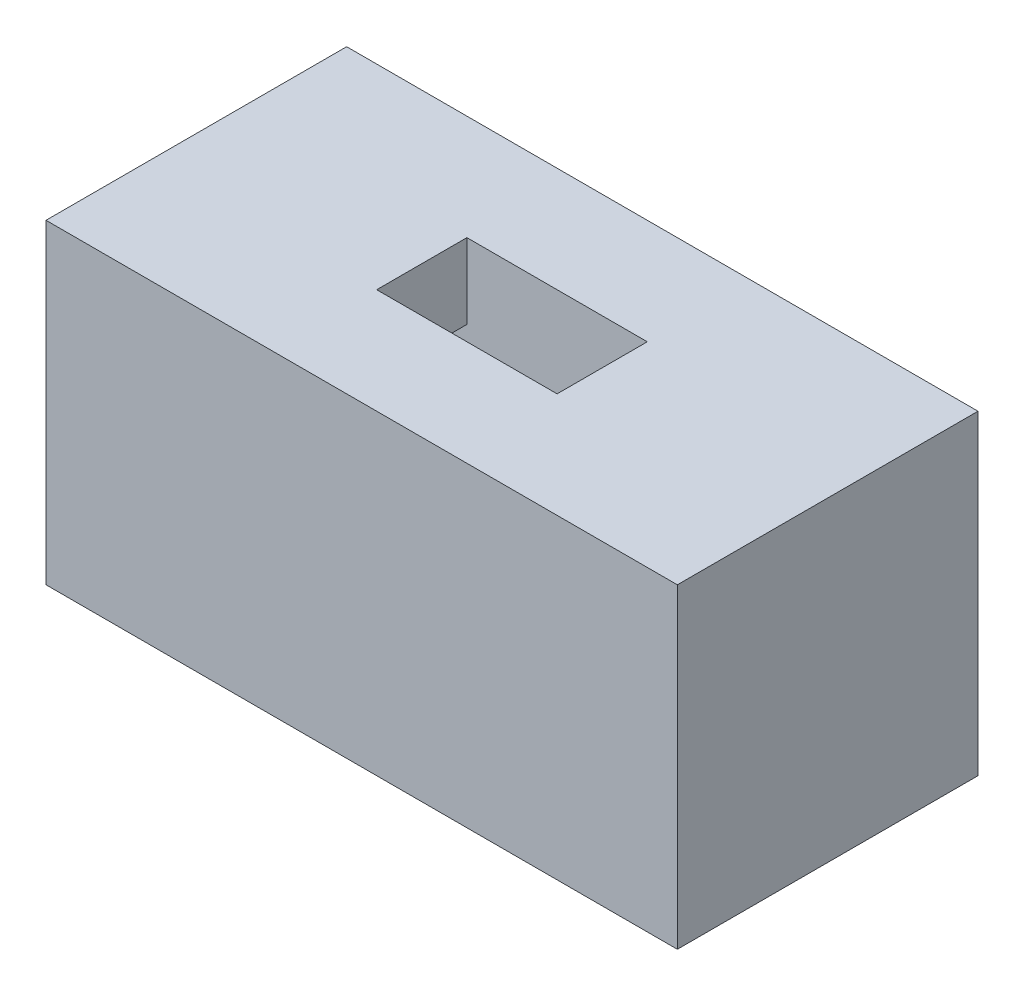
ISO-10303-21;
HEADER;
FILE_DESCRIPTION(('STEP AP214'),'2;1');
FILE_NAME('part.step','',(''),(''),'','','');
FILE_SCHEMA(('AUTOMOTIVE_DESIGN { 1 0 10303 214 1 1 1 1 }'));
ENDSEC;
DATA;
#1=APPLICATION_CONTEXT('core data for automotive mechanical design processes');
#2=APPLICATION_PROTOCOL_DEFINITION('international standard','automotive_design',2000,#1);
#3=PRODUCT_CONTEXT('',#1,'mechanical');
#4=PRODUCT('Part','Part','',(#3));
#5=PRODUCT_RELATED_PRODUCT_CATEGORY('part','',(#4));
#6=PRODUCT_DEFINITION_FORMATION('','',#4);
#7=PRODUCT_DEFINITION_CONTEXT('part definition',#1,'design');
#8=PRODUCT_DEFINITION('design','',#6,#7);
#9=PRODUCT_DEFINITION_SHAPE('','',#8);
#10=(LENGTH_UNIT() NAMED_UNIT(*) SI_UNIT(.MILLI.,.METRE.));
#11=(NAMED_UNIT(*) PLANE_ANGLE_UNIT() SI_UNIT($,.RADIAN.));
#12=(NAMED_UNIT(*) SI_UNIT($,.STERADIAN.) SOLID_ANGLE_UNIT());
#13=UNCERTAINTY_MEASURE_WITH_UNIT(LENGTH_MEASURE(1.E-05),#10,'distance_accuracy_value','');
#14=(GEOMETRIC_REPRESENTATION_CONTEXT(3) GLOBAL_UNCERTAINTY_ASSIGNED_CONTEXT((#13)) GLOBAL_UNIT_ASSIGNED_CONTEXT((#10,
#11,#12)) REPRESENTATION_CONTEXT('',''));
#15=CARTESIAN_POINT('',(0.,0.,0.));
#16=DIRECTION('',(0.,0.,1.));
#17=DIRECTION('',(1.,0.,0.));
#18=AXIS2_PLACEMENT_3D('',#15,#16,#17);
#19=CARTESIAN_POINT('',(21.,21.,-10.));
#20=DIRECTION('',(-1.,0.,0.));
#21=DIRECTION('',(0.,0.,1.));
#22=AXIS2_PLACEMENT_3D('',#19,#20,#21);
#23=PLANE('',#22);
#24=DIRECTION('',(0.,0.,-1.));
#25=VECTOR('',#24,1.);
#26=CARTESIAN_POINT('',(21.,0.,-10.));
#27=LINE('',#26,#25);
#28=CARTESIAN_POINT('',(21.,0.,10.));
#29=VERTEX_POINT('',#28);
#30=CARTESIAN_POINT('',(21.,0.,-10.));
#31=VERTEX_POINT('',#30);
#32=EDGE_CURVE('E160',#29,#31,#27,.T.);
#33=ORIENTED_EDGE('',*,*,#32,.T.);
#34=DIRECTION('',(0.,-1.,0.));
#35=VECTOR('',#34,1.);
#36=CARTESIAN_POINT('',(21.,21.,-10.));
#37=LINE('',#36,#35);
#38=CARTESIAN_POINT('',(21.,21.,-10.));
#39=VERTEX_POINT('',#38);
#40=EDGE_CURVE('E11',#39,#31,#37,.T.);
#41=ORIENTED_EDGE('',*,*,#40,.F.);
#42=DIRECTION('',(0.,0.,-1.));
#43=VECTOR('',#42,1.);
#44=CARTESIAN_POINT('',(21.,21.,-10.));
#45=LINE('',#44,#43);
#46=CARTESIAN_POINT('',(21.,21.,10.));
#47=VERTEX_POINT('',#46);
#48=EDGE_CURVE('E166',#47,#39,#45,.T.);
#49=ORIENTED_EDGE('',*,*,#48,.F.);
#50=DIRECTION('',(0.,-1.,0.));
#51=VECTOR('',#50,1.);
#52=CARTESIAN_POINT('',(21.,21.,10.));
#53=LINE('',#52,#51);
#54=EDGE_CURVE('E176',#47,#29,#53,.T.);
#55=ORIENTED_EDGE('',*,*,#54,.T.);
#56=EDGE_LOOP('',(#33,#41,#49,#55));
#57=FACE_BOUND('',#56,.T.);
#58=ADVANCED_FACE('F37',(#57),#23,.F.);
#59=CARTESIAN_POINT('',(-21.,21.,-10.));
#60=DIRECTION('',(0.,0.,1.));
#61=DIRECTION('',(1.,0.,0.));
#62=AXIS2_PLACEMENT_3D('',#59,#60,#61);
#63=PLANE('',#62);
#64=DIRECTION('',(-1.,0.,0.));
#65=VECTOR('',#64,1.);
#66=CARTESIAN_POINT('',(-21.,0.,-10.));
#67=LINE('',#66,#65);
#68=CARTESIAN_POINT('',(-21.,0.,-10.));
#69=VERTEX_POINT('',#68);
#70=EDGE_CURVE('E179',#31,#69,#67,.T.);
#71=ORIENTED_EDGE('',*,*,#70,.T.);
#72=DIRECTION('',(0.,-1.,0.));
#73=VECTOR('',#72,1.);
#74=CARTESIAN_POINT('',(-21.,21.,-10.));
#75=LINE('',#74,#73);
#76=CARTESIAN_POINT('',(-21.,21.,-10.));
#77=VERTEX_POINT('',#76);
#78=EDGE_CURVE('E44',#77,#69,#75,.T.);
#79=ORIENTED_EDGE('',*,*,#78,.F.);
#80=DIRECTION('',(-1.,0.,0.));
#81=VECTOR('',#80,1.);
#82=CARTESIAN_POINT('',(-21.,21.,-10.));
#83=LINE('',#82,#81);
#84=EDGE_CURVE('E169',#39,#77,#83,.T.);
#85=ORIENTED_EDGE('',*,*,#84,.F.);
#86=ORIENTED_EDGE('',*,*,#40,.T.);
#87=EDGE_LOOP('',(#71,#79,#85,#86));
#88=FACE_BOUND('',#87,.T.);
#89=ADVANCED_FACE('F207',(#88),#63,.F.);
#90=CARTESIAN_POINT('',(-21.,21.,-10.));
#91=DIRECTION('',(1.,0.,0.));
#92=DIRECTION('',(0.,0.,-1.));
#93=AXIS2_PLACEMENT_3D('',#90,#91,#92);
#94=PLANE('',#93);
#95=DIRECTION('',(0.,0.,1.));
#96=VECTOR('',#95,1.);
#97=CARTESIAN_POINT('',(-21.,16.,3.));
#98=LINE('',#97,#96);
#99=CARTESIAN_POINT('',(-21.,16.,-3.));
#100=VERTEX_POINT('',#99);
#101=CARTESIAN_POINT('',(-21.,16.,3.));
#102=VERTEX_POINT('',#101);
#103=EDGE_CURVE('E135',#100,#102,#98,.T.);
#104=ORIENTED_EDGE('',*,*,#103,.T.);
#105=DIRECTION('',(0.,-1.,0.));
#106=VECTOR('',#105,1.);
#107=CARTESIAN_POINT('',(-21.,11.,3.));
#108=LINE('',#107,#106);
#109=CARTESIAN_POINT('',(-21.,11.,3.));
#110=VERTEX_POINT('',#109);
#111=EDGE_CURVE('E119',#102,#110,#108,.T.);
#112=ORIENTED_EDGE('',*,*,#111,.T.);
#113=DIRECTION('',(0.,0.,-1.));
#114=VECTOR('',#113,1.);
#115=CARTESIAN_POINT('',(-21.,11.,3.));
#116=LINE('',#115,#114);
#117=CARTESIAN_POINT('',(-21.,11.,-3.));
#118=VERTEX_POINT('',#117);
#119=EDGE_CURVE('E126',#110,#118,#116,.T.);
#120=ORIENTED_EDGE('',*,*,#119,.T.);
#121=DIRECTION('',(0.,1.,0.));
#122=VECTOR('',#121,1.);
#123=CARTESIAN_POINT('',(-21.,11.,-3.));
#124=LINE('',#123,#122);
#125=EDGE_CURVE('E130',#118,#100,#124,.T.);
#126=ORIENTED_EDGE('',*,*,#125,.T.);
#127=EDGE_LOOP('',(#104,#112,#120,#126));
#128=FACE_BOUND('',#127,.T.);
#129=DIRECTION('',(0.,0.,1.));
#130=VECTOR('',#129,1.);
#131=CARTESIAN_POINT('',(-21.,0.,-10.));
#132=LINE('',#131,#130);
#133=CARTESIAN_POINT('',(-21.,0.,10.));
#134=VERTEX_POINT('',#133);
#135=EDGE_CURVE('E181',#69,#134,#132,.T.);
#136=ORIENTED_EDGE('',*,*,#135,.T.);
#137=DIRECTION('',(0.,-1.,0.));
#138=VECTOR('',#137,1.);
#139=CARTESIAN_POINT('',(-21.,21.,10.));
#140=LINE('',#139,#138);
#141=CARTESIAN_POINT('',(-21.,21.,10.));
#142=VERTEX_POINT('',#141);
#143=EDGE_CURVE('E186',#142,#134,#140,.T.);
#144=ORIENTED_EDGE('',*,*,#143,.F.);
#145=DIRECTION('',(0.,0.,1.));
#146=VECTOR('',#145,1.);
#147=CARTESIAN_POINT('',(-21.,21.,-10.));
#148=LINE('',#147,#146);
#149=EDGE_CURVE('E172',#77,#142,#148,.T.);
#150=ORIENTED_EDGE('',*,*,#149,.F.);
#151=ORIENTED_EDGE('',*,*,#78,.T.);
#152=EDGE_LOOP('',(#136,#144,#150,#151));
#153=FACE_BOUND('',#152,.T.);
#154=ADVANCED_FACE('F132',(#128,#153),#94,.F.);
#155=CARTESIAN_POINT('',(-21.,21.,10.));
#156=DIRECTION('',(0.,0.,-1.));
#157=DIRECTION('',(-1.,0.,0.));
#158=AXIS2_PLACEMENT_3D('',#155,#156,#157);
#159=PLANE('',#158);
#160=DIRECTION('',(1.,0.,0.));
#161=VECTOR('',#160,1.);
#162=CARTESIAN_POINT('',(-21.,0.,10.));
#163=LINE('',#162,#161);
#164=EDGE_CURVE('E170',#134,#29,#163,.T.);
#165=ORIENTED_EDGE('',*,*,#164,.T.);
#166=ORIENTED_EDGE('',*,*,#54,.F.);
#167=DIRECTION('',(1.,0.,0.));
#168=VECTOR('',#167,1.);
#169=CARTESIAN_POINT('',(-21.,21.,10.));
#170=LINE('',#169,#168);
#171=EDGE_CURVE('E174',#142,#47,#170,.T.);
#172=ORIENTED_EDGE('',*,*,#171,.F.);
#173=ORIENTED_EDGE('',*,*,#143,.T.);
#174=EDGE_LOOP('',(#165,#166,#172,#173));
#175=FACE_BOUND('',#174,.T.);
#176=ADVANCED_FACE('F200',(#175),#159,.F.);
#177=CARTESIAN_POINT('',(0.,21.,0.));
#178=DIRECTION('',(0.,1.,0.));
#179=DIRECTION('',(0.,0.,1.));
#180=AXIS2_PLACEMENT_3D('',#177,#178,#179);
#181=PLANE('',#180);
#182=DIRECTION('',(0.,0.,-1.));
#183=VECTOR('',#182,1.);
#184=CARTESIAN_POINT('',(6.,21.,3.));
#185=LINE('',#184,#183);
#186=CARTESIAN_POINT('',(6.,21.,3.));
#187=VERTEX_POINT('',#186);
#188=CARTESIAN_POINT('',(6.,21.,-3.));
#189=VERTEX_POINT('',#188);
#190=EDGE_CURVE('E59',#187,#189,#185,.T.);
#191=ORIENTED_EDGE('',*,*,#190,.F.);
#192=DIRECTION('',(1.,0.,0.));
#193=VECTOR('',#192,1.);
#194=CARTESIAN_POINT('',(-6.,21.,3.));
#195=LINE('',#194,#193);
#196=CARTESIAN_POINT('',(-6.,21.,3.));
#197=VERTEX_POINT('',#196);
#198=EDGE_CURVE('E149',#197,#187,#195,.T.);
#199=ORIENTED_EDGE('',*,*,#198,.F.);
#200=DIRECTION('',(0.,0.,1.));
#201=VECTOR('',#200,1.);
#202=CARTESIAN_POINT('',(-6.,21.,3.));
#203=LINE('',#202,#201);
#204=CARTESIAN_POINT('',(-6.,21.,-3.));
#205=VERTEX_POINT('',#204);
#206=EDGE_CURVE('E155',#205,#197,#203,.T.);
#207=ORIENTED_EDGE('',*,*,#206,.F.);
#208=DIRECTION('',(-1.,0.,0.));
#209=VECTOR('',#208,1.);
#210=CARTESIAN_POINT('',(-6.,21.,-3.));
#211=LINE('',#210,#209);
#212=EDGE_CURVE('E152',#189,#205,#211,.T.);
#213=ORIENTED_EDGE('',*,*,#212,.F.);
#214=EDGE_LOOP('',(#191,#199,#207,#213));
#215=FACE_BOUND('',#214,.T.);
#216=ORIENTED_EDGE('',*,*,#48,.T.);
#217=ORIENTED_EDGE('',*,*,#84,.T.);
#218=ORIENTED_EDGE('',*,*,#149,.T.);
#219=ORIENTED_EDGE('',*,*,#171,.T.);
#220=EDGE_LOOP('',(#216,#217,#218,#219));
#221=FACE_BOUND('',#220,.T.);
#222=ADVANCED_FACE('F206',(#215,#221),#181,.T.);
#223=CARTESIAN_POINT('',(0.,0.,0.));
#224=DIRECTION('',(0.,1.,0.));
#225=DIRECTION('',(0.,0.,1.));
#226=AXIS2_PLACEMENT_3D('',#223,#224,#225);
#227=PLANE('',#226);
#228=ORIENTED_EDGE('',*,*,#32,.F.);
#229=ORIENTED_EDGE('',*,*,#164,.F.);
#230=ORIENTED_EDGE('',*,*,#135,.F.);
#231=ORIENTED_EDGE('',*,*,#70,.F.);
#232=EDGE_LOOP('',(#228,#229,#230,#231));
#233=FACE_BOUND('',#232,.T.);
#234=ADVANCED_FACE('F197',(#233),#227,.F.);
#235=CARTESIAN_POINT('',(6.,11.,3.));
#236=DIRECTION('',(1.,0.,0.));
#237=DIRECTION('',(0.,0.,-1.));
#238=AXIS2_PLACEMENT_3D('',#235,#236,#237);
#239=PLANE('',#238);
#240=ORIENTED_EDGE('',*,*,#190,.T.);
#241=DIRECTION('',(0.,1.,0.));
#242=VECTOR('',#241,1.);
#243=CARTESIAN_POINT('',(6.,11.,-3.));
#244=LINE('',#243,#242);
#245=CARTESIAN_POINT('',(6.,11.,-3.));
#246=VERTEX_POINT('',#245);
#247=EDGE_CURVE('E123',#246,#189,#244,.T.);
#248=ORIENTED_EDGE('',*,*,#247,.F.);
#249=DIRECTION('',(0.,0.,-1.));
#250=VECTOR('',#249,1.);
#251=CARTESIAN_POINT('',(6.,11.,3.));
#252=LINE('',#251,#250);
#253=CARTESIAN_POINT('',(6.,11.,3.));
#254=VERTEX_POINT('',#253);
#255=EDGE_CURVE('E147',#254,#246,#252,.T.);
#256=ORIENTED_EDGE('',*,*,#255,.F.);
#257=DIRECTION('',(0.,1.,0.));
#258=VECTOR('',#257,1.);
#259=CARTESIAN_POINT('',(6.,11.,3.));
#260=LINE('',#259,#258);
#261=EDGE_CURVE('E121',#254,#187,#260,.T.);
#262=ORIENTED_EDGE('',*,*,#261,.T.);
#263=EDGE_LOOP('',(#240,#248,#256,#262));
#264=FACE_BOUND('',#263,.T.);
#265=ADVANCED_FACE('F219',(#264),#239,.F.);
#266=CARTESIAN_POINT('',(-6.,11.,3.));
#267=DIRECTION('',(0.,0.,1.));
#268=DIRECTION('',(1.,0.,0.));
#269=AXIS2_PLACEMENT_3D('',#266,#267,#268);
#270=PLANE('',#269);
#271=ORIENTED_EDGE('',*,*,#198,.T.);
#272=ORIENTED_EDGE('',*,*,#261,.F.);
#273=DIRECTION('',(1.,0.,0.));
#274=VECTOR('',#273,1.);
#275=CARTESIAN_POINT('',(-6.,11.,3.));
#276=LINE('',#275,#274);
#277=EDGE_CURVE('E115',#110,#254,#276,.T.);
#278=ORIENTED_EDGE('',*,*,#277,.F.);
#279=ORIENTED_EDGE('',*,*,#111,.F.);
#280=DIRECTION('',(1.,0.,0.));
#281=VECTOR('',#280,1.);
#282=CARTESIAN_POINT('',(-21.,16.,3.));
#283=LINE('',#282,#281);
#284=CARTESIAN_POINT('',(-6.,16.,3.));
#285=VERTEX_POINT('',#284);
#286=EDGE_CURVE('E144',#102,#285,#283,.T.);
#287=ORIENTED_EDGE('',*,*,#286,.T.);
#288=DIRECTION('',(0.,1.,0.));
#289=VECTOR('',#288,1.);
#290=CARTESIAN_POINT('',(-6.,11.,3.));
#291=LINE('',#290,#289);
#292=EDGE_CURVE('E161',#285,#197,#291,.T.);
#293=ORIENTED_EDGE('',*,*,#292,.T.);
#294=EDGE_LOOP('',(#271,#272,#278,#279,#287,#293));
#295=FACE_BOUND('',#294,.T.);
#296=ADVANCED_FACE('F117',(#295),#270,.F.);
#297=CARTESIAN_POINT('',(-6.,11.,3.));
#298=DIRECTION('',(-1.,0.,0.));
#299=DIRECTION('',(0.,0.,1.));
#300=AXIS2_PLACEMENT_3D('',#297,#298,#299);
#301=PLANE('',#300);
#302=ORIENTED_EDGE('',*,*,#292,.F.);
#303=DIRECTION('',(0.,0.,1.));
#304=VECTOR('',#303,1.);
#305=CARTESIAN_POINT('',(-6.,16.,3.));
#306=LINE('',#305,#304);
#307=CARTESIAN_POINT('',(-6.,16.,-3.));
#308=VERTEX_POINT('',#307);
#309=EDGE_CURVE('E136',#308,#285,#306,.T.);
#310=ORIENTED_EDGE('',*,*,#309,.F.);
#311=DIRECTION('',(0.,1.,0.));
#312=VECTOR('',#311,1.);
#313=CARTESIAN_POINT('',(-6.,11.,-3.));
#314=LINE('',#313,#312);
#315=EDGE_CURVE('E163',#308,#205,#314,.T.);
#316=ORIENTED_EDGE('',*,*,#315,.T.);
#317=ORIENTED_EDGE('',*,*,#206,.T.);
#318=EDGE_LOOP('',(#302,#310,#316,#317));
#319=FACE_BOUND('',#318,.T.);
#320=ADVANCED_FACE('F228',(#319),#301,.F.);
#321=CARTESIAN_POINT('',(-6.,11.,-3.));
#322=DIRECTION('',(0.,0.,-1.));
#323=DIRECTION('',(-1.,0.,0.));
#324=AXIS2_PLACEMENT_3D('',#321,#322,#323);
#325=PLANE('',#324);
#326=ORIENTED_EDGE('',*,*,#212,.T.);
#327=ORIENTED_EDGE('',*,*,#315,.F.);
#328=DIRECTION('',(1.,0.,0.));
#329=VECTOR('',#328,1.);
#330=CARTESIAN_POINT('',(-21.,16.,-3.));
#331=LINE('',#330,#329);
#332=EDGE_CURVE('E142',#100,#308,#331,.T.);
#333=ORIENTED_EDGE('',*,*,#332,.F.);
#334=ORIENTED_EDGE('',*,*,#125,.F.);
#335=DIRECTION('',(-1.,0.,0.));
#336=VECTOR('',#335,1.);
#337=CARTESIAN_POINT('',(-6.,11.,-3.));
#338=LINE('',#337,#336);
#339=EDGE_CURVE('E51',#246,#118,#338,.T.);
#340=ORIENTED_EDGE('',*,*,#339,.F.);
#341=ORIENTED_EDGE('',*,*,#247,.T.);
#342=EDGE_LOOP('',(#326,#327,#333,#334,#340,#341));
#343=FACE_BOUND('',#342,.T.);
#344=ADVANCED_FACE('F225',(#343),#325,.F.);
#345=CARTESIAN_POINT('',(0.,11.,0.));
#346=DIRECTION('',(0.,-1.,0.));
#347=DIRECTION('',(0.,0.,-1.));
#348=AXIS2_PLACEMENT_3D('',#345,#346,#347);
#349=PLANE('',#348);
#350=ORIENTED_EDGE('',*,*,#255,.T.);
#351=ORIENTED_EDGE('',*,*,#339,.T.);
#352=ORIENTED_EDGE('',*,*,#119,.F.);
#353=ORIENTED_EDGE('',*,*,#277,.T.);
#354=EDGE_LOOP('',(#350,#351,#352,#353));
#355=FACE_BOUND('',#354,.T.);
#356=ADVANCED_FACE('F127',(#355),#349,.F.);
#357=CARTESIAN_POINT('',(-21.,16.,3.));
#358=DIRECTION('',(0.,1.,0.));
#359=DIRECTION('',(0.,0.,1.));
#360=AXIS2_PLACEMENT_3D('',#357,#358,#359);
#361=PLANE('',#360);
#362=ORIENTED_EDGE('',*,*,#309,.T.);
#363=ORIENTED_EDGE('',*,*,#286,.F.);
#364=ORIENTED_EDGE('',*,*,#103,.F.);
#365=ORIENTED_EDGE('',*,*,#332,.T.);
#366=EDGE_LOOP('',(#362,#363,#364,#365));
#367=FACE_BOUND('',#366,.T.);
#368=ADVANCED_FACE('F237',(#367),#361,.F.);
#369=CLOSED_SHELL('',(#58,#89,#154,#176,#222,#234,#265,#296,#320,#344,#356,#368));
#370=MANIFOLD_SOLID_BREP('B2',#369);
#371=ADVANCED_BREP_SHAPE_REPRESENTATION('',(#18,#370),#14);
#372=SHAPE_DEFINITION_REPRESENTATION(#9,#371);
ENDSEC;
END-ISO-10303-21;
